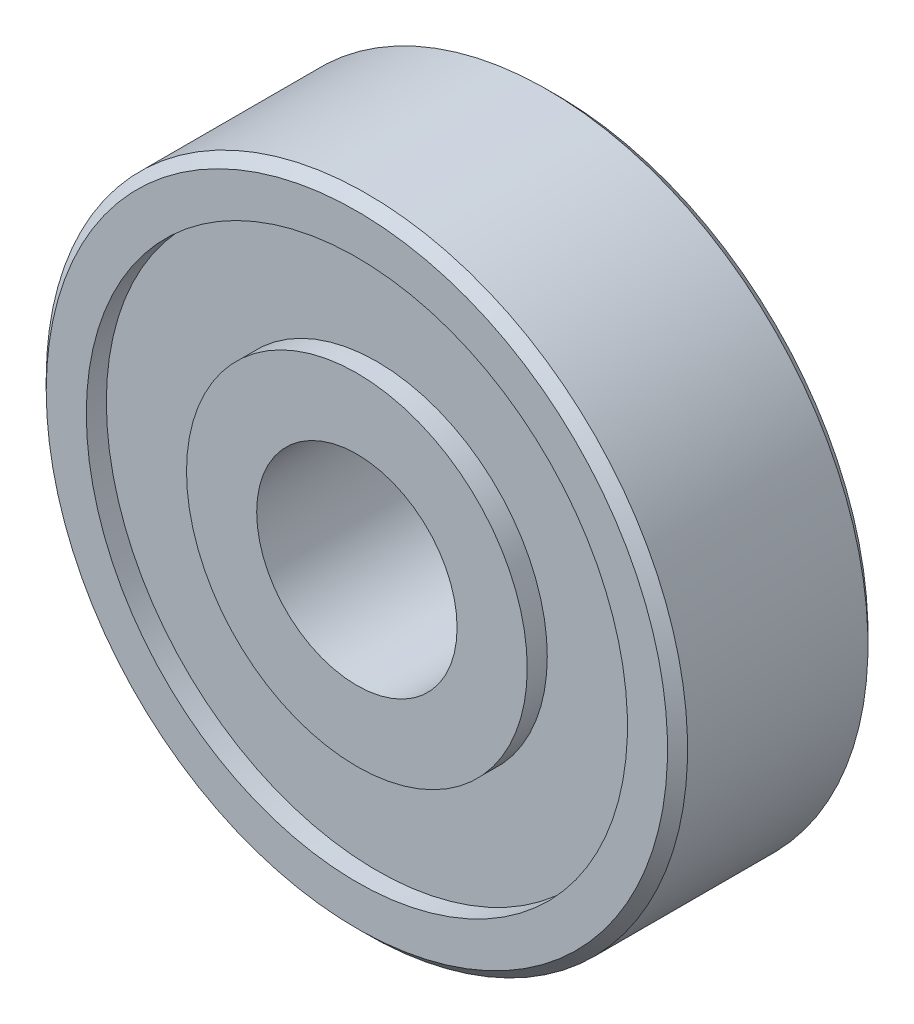
ISO-10303-21;
HEADER;
FILE_DESCRIPTION(('STEP AP214'),'2;1');
FILE_NAME('part.step','',(''),(''),'','','');
FILE_SCHEMA(('AUTOMOTIVE_DESIGN { 1 0 10303 214 1 1 1 1 }'));
ENDSEC;
DATA;
#1=APPLICATION_CONTEXT('core data for automotive mechanical design processes');
#2=APPLICATION_PROTOCOL_DEFINITION('international standard','automotive_design',2000,#1);
#3=PRODUCT_CONTEXT('',#1,'mechanical');
#4=PRODUCT('Part','Part','',(#3));
#5=PRODUCT_RELATED_PRODUCT_CATEGORY('part','',(#4));
#6=PRODUCT_DEFINITION_FORMATION('','',#4);
#7=PRODUCT_DEFINITION_CONTEXT('part definition',#1,'design');
#8=PRODUCT_DEFINITION('design','',#6,#7);
#9=PRODUCT_DEFINITION_SHAPE('','',#8);
#10=(LENGTH_UNIT() NAMED_UNIT(*) SI_UNIT(.MILLI.,.METRE.));
#11=(NAMED_UNIT(*) PLANE_ANGLE_UNIT() SI_UNIT($,.RADIAN.));
#12=(NAMED_UNIT(*) SI_UNIT($,.STERADIAN.) SOLID_ANGLE_UNIT());
#13=UNCERTAINTY_MEASURE_WITH_UNIT(LENGTH_MEASURE(1.E-05),#10,'distance_accuracy_value','');
#14=(GEOMETRIC_REPRESENTATION_CONTEXT(3) GLOBAL_UNCERTAINTY_ASSIGNED_CONTEXT((#13)) GLOBAL_UNIT_ASSIGNED_CONTEXT((#10,
#11,#12)) REPRESENTATION_CONTEXT('',''));
#15=CARTESIAN_POINT('',(0.,0.,0.));
#16=DIRECTION('',(0.,0.,1.));
#17=DIRECTION('',(1.,0.,0.));
#18=AXIS2_PLACEMENT_3D('',#15,#16,#17);
#19=CARTESIAN_POINT('',(-1.5,0.,2.5));
#20=DIRECTION('',(0.,0.,-1.));
#21=DIRECTION('',(-1.,0.,0.));
#22=AXIS2_PLACEMENT_3D('',#19,#20,#21);
#23=CYLINDRICAL_SURFACE('',#22,8.);
#24=CARTESIAN_POINT('',(-1.5,0.,2.25));
#25=DIRECTION('',(0.,0.,-1.));
#26=DIRECTION('',(-1.,0.,0.));
#27=AXIS2_PLACEMENT_3D('',#24,#25,#26);
#28=CIRCLE('',#27,8.);
#29=CARTESIAN_POINT('',(-9.5,0.,2.25));
#30=VERTEX_POINT('',#29);
#31=EDGE_CURVE('E10',#30,#30,#28,.T.);
#32=ORIENTED_EDGE('',*,*,#31,.T.);
#33=EDGE_LOOP('',(#32));
#34=FACE_BOUND('',#33,.T.);
#35=CARTESIAN_POINT('',(-1.5,0.,-2.25));
#36=DIRECTION('',(0.,0.,-1.));
#37=DIRECTION('',(-1.,0.,0.));
#38=AXIS2_PLACEMENT_3D('',#35,#36,#37);
#39=CIRCLE('',#38,8.);
#40=CARTESIAN_POINT('',(-9.5,0.,-2.25));
#41=VERTEX_POINT('',#40);
#42=EDGE_CURVE('E77',#41,#41,#39,.T.);
#43=ORIENTED_EDGE('',*,*,#42,.F.);
#44=EDGE_LOOP('',(#43));
#45=FACE_BOUND('',#44,.T.);
#46=ADVANCED_FACE('F31',(#34,#45),#23,.T.);
#47=CARTESIAN_POINT('',(-1.5,0.,2.25));
#48=DIRECTION('',(0.,0.,-1.));
#49=DIRECTION('',(-1.,0.,0.));
#50=AXIS2_PLACEMENT_3D('',#47,#48,#49);
#51=CONICAL_SURFACE('',#50,8.,0.785398163397456);
#52=CARTESIAN_POINT('',(-1.5,0.,2.5));
#53=DIRECTION('',(0.,0.,-1.));
#54=DIRECTION('',(-1.,0.,0.));
#55=AXIS2_PLACEMENT_3D('',#52,#53,#54);
#56=CIRCLE('',#55,7.75);
#57=CARTESIAN_POINT('',(-9.25,0.,2.5));
#58=VERTEX_POINT('',#57);
#59=EDGE_CURVE('E37',#58,#58,#56,.T.);
#60=ORIENTED_EDGE('',*,*,#59,.T.);
#61=EDGE_LOOP('',(#60));
#62=FACE_BOUND('',#61,.T.);
#63=ORIENTED_EDGE('',*,*,#31,.F.);
#64=EDGE_LOOP('',(#63));
#65=FACE_BOUND('',#64,.T.);
#66=ADVANCED_FACE('F85',(#62,#65),#51,.T.);
#67=CARTESIAN_POINT('',(6.25,0.,2.5));
#68=DIRECTION('',(0.,0.,1.));
#69=DIRECTION('',(1.,0.,0.));
#70=AXIS2_PLACEMENT_3D('',#67,#68,#69);
#71=PLANE('',#70);
#72=CARTESIAN_POINT('',(-1.5,0.,2.5));
#73=DIRECTION('',(0.,0.,-1.));
#74=DIRECTION('',(-1.,0.,0.));
#75=AXIS2_PLACEMENT_3D('',#72,#73,#74);
#76=CIRCLE('',#75,6.75);
#77=CARTESIAN_POINT('',(-8.25,0.,2.5));
#78=VERTEX_POINT('',#77);
#79=EDGE_CURVE('E41',#78,#78,#76,.T.);
#80=ORIENTED_EDGE('',*,*,#79,.T.);
#81=EDGE_LOOP('',(#80));
#82=FACE_BOUND('',#81,.T.);
#83=ORIENTED_EDGE('',*,*,#59,.F.);
#84=EDGE_LOOP('',(#83));
#85=FACE_BOUND('',#84,.T.);
#86=ADVANCED_FACE('F89',(#82,#85),#71,.T.);
#87=CARTESIAN_POINT('',(-1.5,0.,2.5));
#88=DIRECTION('',(0.,0.,-1.));
#89=DIRECTION('',(-1.,0.,0.));
#90=AXIS2_PLACEMENT_3D('',#87,#88,#89);
#91=CYLINDRICAL_SURFACE('',#90,6.75);
#92=CARTESIAN_POINT('',(-1.5,0.,2.));
#93=DIRECTION('',(0.,0.,-1.));
#94=DIRECTION('',(-1.,0.,0.));
#95=AXIS2_PLACEMENT_3D('',#92,#93,#94);
#96=CIRCLE('',#95,6.75);
#97=CARTESIAN_POINT('',(-8.25,0.,2.));
#98=VERTEX_POINT('',#97);
#99=EDGE_CURVE('E45',#98,#98,#96,.T.);
#100=ORIENTED_EDGE('',*,*,#99,.T.);
#101=EDGE_LOOP('',(#100));
#102=FACE_BOUND('',#101,.T.);
#103=ORIENTED_EDGE('',*,*,#79,.F.);
#104=EDGE_LOOP('',(#103));
#105=FACE_BOUND('',#104,.T.);
#106=ADVANCED_FACE('F93',(#102,#105),#91,.F.);
#107=CARTESIAN_POINT('',(5.25,0.,2.));
#108=DIRECTION('',(0.,0.,1.));
#109=DIRECTION('',(1.,0.,0.));
#110=AXIS2_PLACEMENT_3D('',#107,#108,#109);
#111=PLANE('',#110);
#112=CARTESIAN_POINT('',(-1.5,0.,2.));
#113=DIRECTION('',(0.,0.,-1.));
#114=DIRECTION('',(-1.,0.,0.));
#115=AXIS2_PLACEMENT_3D('',#112,#113,#114);
#116=CIRCLE('',#115,4.25);
#117=CARTESIAN_POINT('',(-5.75,0.,2.));
#118=VERTEX_POINT('',#117);
#119=EDGE_CURVE('E50',#118,#118,#116,.T.);
#120=ORIENTED_EDGE('',*,*,#119,.T.);
#121=EDGE_LOOP('',(#120));
#122=FACE_BOUND('',#121,.T.);
#123=ORIENTED_EDGE('',*,*,#99,.F.);
#124=EDGE_LOOP('',(#123));
#125=FACE_BOUND('',#124,.T.);
#126=ADVANCED_FACE('F100',(#122,#125),#111,.T.);
#127=CARTESIAN_POINT('',(-1.5,0.,2.5));
#128=DIRECTION('',(0.,0.,-1.));
#129=DIRECTION('',(-1.,0.,0.));
#130=AXIS2_PLACEMENT_3D('',#127,#128,#129);
#131=CYLINDRICAL_SURFACE('',#130,4.25);
#132=CARTESIAN_POINT('',(-1.5,0.,2.5));
#133=DIRECTION('',(0.,0.,-1.));
#134=DIRECTION('',(-1.,0.,0.));
#135=AXIS2_PLACEMENT_3D('',#132,#133,#134);
#136=CIRCLE('',#135,4.25);
#137=CARTESIAN_POINT('',(-5.75,0.,2.5));
#138=VERTEX_POINT('',#137);
#139=EDGE_CURVE('E53',#138,#138,#136,.T.);
#140=ORIENTED_EDGE('',*,*,#139,.T.);
#141=EDGE_LOOP('',(#140));
#142=FACE_BOUND('',#141,.T.);
#143=ORIENTED_EDGE('',*,*,#119,.F.);
#144=EDGE_LOOP('',(#143));
#145=FACE_BOUND('',#144,.T.);
#146=ADVANCED_FACE('F104',(#142,#145),#131,.T.);
#147=CARTESIAN_POINT('',(2.75,0.,2.5));
#148=DIRECTION('',(0.,0.,1.));
#149=DIRECTION('',(1.,0.,0.));
#150=AXIS2_PLACEMENT_3D('',#147,#148,#149);
#151=PLANE('',#150);
#152=CARTESIAN_POINT('',(-1.5,0.,2.5));
#153=DIRECTION('',(0.,0.,-1.));
#154=DIRECTION('',(-1.,0.,0.));
#155=AXIS2_PLACEMENT_3D('',#152,#153,#154);
#156=CIRCLE('',#155,2.5);
#157=CARTESIAN_POINT('',(-4.,0.,2.5));
#158=VERTEX_POINT('',#157);
#159=EDGE_CURVE('E56',#158,#158,#156,.T.);
#160=ORIENTED_EDGE('',*,*,#159,.T.);
#161=EDGE_LOOP('',(#160));
#162=FACE_BOUND('',#161,.T.);
#163=ORIENTED_EDGE('',*,*,#139,.F.);
#164=EDGE_LOOP('',(#163));
#165=FACE_BOUND('',#164,.T.);
#166=ADVANCED_FACE('F108',(#162,#165),#151,.T.);
#167=CARTESIAN_POINT('',(-1.5,0.,2.5));
#168=DIRECTION('',(0.,0.,-1.));
#169=DIRECTION('',(-1.,0.,0.));
#170=AXIS2_PLACEMENT_3D('',#167,#168,#169);
#171=CYLINDRICAL_SURFACE('',#170,2.5);
#172=CARTESIAN_POINT('',(-1.5,0.,-2.5));
#173=DIRECTION('',(0.,0.,-1.));
#174=DIRECTION('',(-1.,0.,0.));
#175=AXIS2_PLACEMENT_3D('',#172,#173,#174);
#176=CIRCLE('',#175,2.5);
#177=CARTESIAN_POINT('',(-4.,0.,-2.5));
#178=VERTEX_POINT('',#177);
#179=EDGE_CURVE('E59',#178,#178,#176,.T.);
#180=ORIENTED_EDGE('',*,*,#179,.T.);
#181=EDGE_LOOP('',(#180));
#182=FACE_BOUND('',#181,.T.);
#183=ORIENTED_EDGE('',*,*,#159,.F.);
#184=EDGE_LOOP('',(#183));
#185=FACE_BOUND('',#184,.T.);
#186=ADVANCED_FACE('F112',(#182,#185),#171,.F.);
#187=CARTESIAN_POINT('',(1.,0.,-2.5));
#188=DIRECTION('',(0.,0.,-1.));
#189=DIRECTION('',(-1.,0.,0.));
#190=AXIS2_PLACEMENT_3D('',#187,#188,#189);
#191=PLANE('',#190);
#192=CARTESIAN_POINT('',(-1.5,0.,-2.5));
#193=DIRECTION('',(0.,0.,-1.));
#194=DIRECTION('',(-1.,0.,0.));
#195=AXIS2_PLACEMENT_3D('',#192,#193,#194);
#196=CIRCLE('',#195,4.25);
#197=CARTESIAN_POINT('',(-5.75,0.,-2.5));
#198=VERTEX_POINT('',#197);
#199=EDGE_CURVE('E62',#198,#198,#196,.T.);
#200=ORIENTED_EDGE('',*,*,#199,.T.);
#201=EDGE_LOOP('',(#200));
#202=FACE_BOUND('',#201,.T.);
#203=ORIENTED_EDGE('',*,*,#179,.F.);
#204=EDGE_LOOP('',(#203));
#205=FACE_BOUND('',#204,.T.);
#206=ADVANCED_FACE('F116',(#202,#205),#191,.T.);
#207=CARTESIAN_POINT('',(-1.5,0.,2.5));
#208=DIRECTION('',(0.,0.,-1.));
#209=DIRECTION('',(-1.,0.,0.));
#210=AXIS2_PLACEMENT_3D('',#207,#208,#209);
#211=CYLINDRICAL_SURFACE('',#210,4.25);
#212=CARTESIAN_POINT('',(-1.5,0.,-2.));
#213=DIRECTION('',(0.,0.,-1.));
#214=DIRECTION('',(-1.,0.,0.));
#215=AXIS2_PLACEMENT_3D('',#212,#213,#214);
#216=CIRCLE('',#215,4.25);
#217=CARTESIAN_POINT('',(-5.75,0.,-2.));
#218=VERTEX_POINT('',#217);
#219=EDGE_CURVE('E65',#218,#218,#216,.T.);
#220=ORIENTED_EDGE('',*,*,#219,.T.);
#221=EDGE_LOOP('',(#220));
#222=FACE_BOUND('',#221,.T.);
#223=ORIENTED_EDGE('',*,*,#199,.F.);
#224=EDGE_LOOP('',(#223));
#225=FACE_BOUND('',#224,.T.);
#226=ADVANCED_FACE('F120',(#222,#225),#211,.T.);
#227=CARTESIAN_POINT('',(2.75,0.,-2.));
#228=DIRECTION('',(0.,0.,-1.));
#229=DIRECTION('',(-1.,0.,0.));
#230=AXIS2_PLACEMENT_3D('',#227,#228,#229);
#231=PLANE('',#230);
#232=CARTESIAN_POINT('',(-1.5,0.,-2.));
#233=DIRECTION('',(0.,0.,-1.));
#234=DIRECTION('',(-1.,0.,0.));
#235=AXIS2_PLACEMENT_3D('',#232,#233,#234);
#236=CIRCLE('',#235,6.75);
#237=CARTESIAN_POINT('',(-8.25,0.,-2.));
#238=VERTEX_POINT('',#237);
#239=EDGE_CURVE('E68',#238,#238,#236,.T.);
#240=ORIENTED_EDGE('',*,*,#239,.T.);
#241=EDGE_LOOP('',(#240));
#242=FACE_BOUND('',#241,.T.);
#243=ORIENTED_EDGE('',*,*,#219,.F.);
#244=EDGE_LOOP('',(#243));
#245=FACE_BOUND('',#244,.T.);
#246=ADVANCED_FACE('F124',(#242,#245),#231,.T.);
#247=CARTESIAN_POINT('',(-1.5,0.,2.5));
#248=DIRECTION('',(0.,0.,-1.));
#249=DIRECTION('',(-1.,0.,0.));
#250=AXIS2_PLACEMENT_3D('',#247,#248,#249);
#251=CYLINDRICAL_SURFACE('',#250,6.75);
#252=CARTESIAN_POINT('',(-1.5,0.,-2.5));
#253=DIRECTION('',(0.,0.,-1.));
#254=DIRECTION('',(-1.,0.,0.));
#255=AXIS2_PLACEMENT_3D('',#252,#253,#254);
#256=CIRCLE('',#255,6.75);
#257=CARTESIAN_POINT('',(-8.25,0.,-2.5));
#258=VERTEX_POINT('',#257);
#259=EDGE_CURVE('E71',#258,#258,#256,.T.);
#260=ORIENTED_EDGE('',*,*,#259,.T.);
#261=EDGE_LOOP('',(#260));
#262=FACE_BOUND('',#261,.T.);
#263=ORIENTED_EDGE('',*,*,#239,.F.);
#264=EDGE_LOOP('',(#263));
#265=FACE_BOUND('',#264,.T.);
#266=ADVANCED_FACE('F128',(#262,#265),#251,.F.);
#267=CARTESIAN_POINT('',(5.25,0.,-2.5));
#268=DIRECTION('',(0.,0.,-1.));
#269=DIRECTION('',(-1.,0.,0.));
#270=AXIS2_PLACEMENT_3D('',#267,#268,#269);
#271=PLANE('',#270);
#272=CARTESIAN_POINT('',(-1.5,0.,-2.5));
#273=DIRECTION('',(0.,0.,-1.));
#274=DIRECTION('',(-1.,0.,0.));
#275=AXIS2_PLACEMENT_3D('',#272,#273,#274);
#276=CIRCLE('',#275,7.75);
#277=CARTESIAN_POINT('',(-9.25,0.,-2.5));
#278=VERTEX_POINT('',#277);
#279=EDGE_CURVE('E74',#278,#278,#276,.T.);
#280=ORIENTED_EDGE('',*,*,#279,.T.);
#281=EDGE_LOOP('',(#280));
#282=FACE_BOUND('',#281,.T.);
#283=ORIENTED_EDGE('',*,*,#259,.F.);
#284=EDGE_LOOP('',(#283));
#285=FACE_BOUND('',#284,.T.);
#286=ADVANCED_FACE('F132',(#282,#285),#271,.T.);
#287=CARTESIAN_POINT('',(-1.5,0.,-2.5));
#288=DIRECTION('',(0.,0.,1.));
#289=DIRECTION('',(1.,0.,0.));
#290=AXIS2_PLACEMENT_3D('',#287,#288,#289);
#291=CONICAL_SURFACE('',#290,7.75,0.785398163397452);
#292=ORIENTED_EDGE('',*,*,#42,.T.);
#293=EDGE_LOOP('',(#292));
#294=FACE_BOUND('',#293,.T.);
#295=ORIENTED_EDGE('',*,*,#279,.F.);
#296=EDGE_LOOP('',(#295));
#297=FACE_BOUND('',#296,.T.);
#298=ADVANCED_FACE('F81',(#294,#297),#291,.T.);
#299=CLOSED_SHELL('',(#46,#66,#86,#106,#126,#146,#166,#186,#206,#226,#246,#266,#286,#298));
#300=MANIFOLD_SOLID_BREP('B2',#299);
#301=ADVANCED_BREP_SHAPE_REPRESENTATION('',(#18,#300),#14);
#302=SHAPE_DEFINITION_REPRESENTATION(#9,#301);
ENDSEC;
END-ISO-10303-21;
